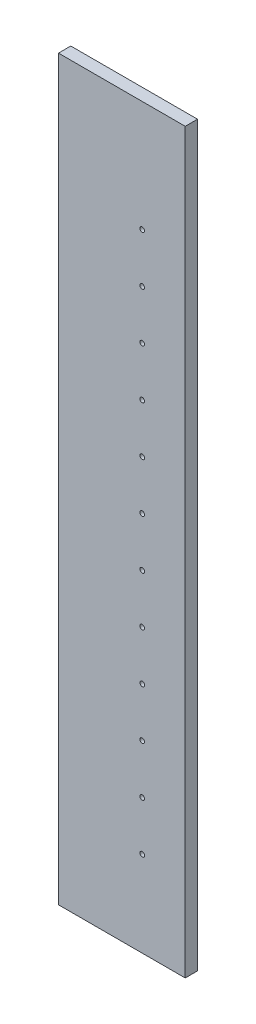
ISO-10303-21;
HEADER;
FILE_DESCRIPTION(('STEP AP214'),'2;1');
FILE_NAME('part.step','',(''),(''),'','','');
FILE_SCHEMA(('AUTOMOTIVE_DESIGN { 1 0 10303 214 1 1 1 1 }'));
ENDSEC;
DATA;
#1=APPLICATION_CONTEXT('core data for automotive mechanical design processes');
#2=APPLICATION_PROTOCOL_DEFINITION('international standard','automotive_design',2000,#1);
#3=PRODUCT_CONTEXT('',#1,'mechanical');
#4=PRODUCT('Part','Part','',(#3));
#5=PRODUCT_RELATED_PRODUCT_CATEGORY('part','',(#4));
#6=PRODUCT_DEFINITION_FORMATION('','',#4);
#7=PRODUCT_DEFINITION_CONTEXT('part definition',#1,'design');
#8=PRODUCT_DEFINITION('design','',#6,#7);
#9=PRODUCT_DEFINITION_SHAPE('','',#8);
#10=(LENGTH_UNIT() NAMED_UNIT(*) SI_UNIT(.MILLI.,.METRE.));
#11=(NAMED_UNIT(*) PLANE_ANGLE_UNIT() SI_UNIT($,.RADIAN.));
#12=(NAMED_UNIT(*) SI_UNIT($,.STERADIAN.) SOLID_ANGLE_UNIT());
#13=UNCERTAINTY_MEASURE_WITH_UNIT(LENGTH_MEASURE(1.E-05),#10,'distance_accuracy_value','');
#14=(GEOMETRIC_REPRESENTATION_CONTEXT(3) GLOBAL_UNCERTAINTY_ASSIGNED_CONTEXT((#13)) GLOBAL_UNIT_ASSIGNED_CONTEXT((#10,
#11,#12)) REPRESENTATION_CONTEXT('',''));
#15=CARTESIAN_POINT('',(0.,0.,0.));
#16=DIRECTION('',(0.,0.,1.));
#17=DIRECTION('',(1.,0.,0.));
#18=AXIS2_PLACEMENT_3D('',#15,#16,#17);
#19=CARTESIAN_POINT('',(0.,0.,-2.50339508056641E-06));
#20=DIRECTION('',(0.,0.,1.));
#21=DIRECTION('',(1.,0.,0.));
#22=AXIS2_PLACEMENT_3D('',#19,#20,#21);
#23=PLANE('',#22);
#24=CARTESIAN_POINT('',(10.8999881744385,11.1500005722046,-2.50339508064273E-06));
#25=DIRECTION('',(0.,0.,1.));
#26=DIRECTION('',(1.,0.,0.));
#27=AXIS2_PLACEMENT_3D('',#24,#25,#26);
#28=CIRCLE('',#27,0.305499374866486);
#29=CARTESIAN_POINT('',(11.205487549305,11.1500005722046,-2.50339508064273E-06));
#30=VERTEX_POINT('',#29);
#31=EDGE_CURVE('E140',#30,#30,#28,.F.);
#32=ORIENTED_EDGE('',*,*,#31,.T.);
#33=EDGE_LOOP('',(#32));
#34=FACE_BOUND('',#33,.T.);
#35=CARTESIAN_POINT('',(10.8999881744385,17.5500011444092,-2.50339508064273E-06));
#36=DIRECTION('',(0.,0.,1.));
#37=DIRECTION('',(1.,0.,0.));
#38=AXIS2_PLACEMENT_3D('',#35,#36,#37);
#39=CIRCLE('',#38,0.305499374866486);
#40=CARTESIAN_POINT('',(11.205487549305,17.5500011444092,-2.50339508064273E-06));
#41=VERTEX_POINT('',#40);
#42=EDGE_CURVE('E143',#41,#41,#39,.F.);
#43=ORIENTED_EDGE('',*,*,#42,.T.);
#44=EDGE_LOOP('',(#43));
#45=FACE_BOUND('',#44,.T.);
#46=CARTESIAN_POINT('',(10.8999881744385,23.9500007629395,-2.50339508064273E-06));
#47=DIRECTION('',(0.,0.,1.));
#48=DIRECTION('',(1.,0.,0.));
#49=AXIS2_PLACEMENT_3D('',#46,#47,#48);
#50=CIRCLE('',#49,0.305499374866486);
#51=CARTESIAN_POINT('',(11.205487549305,23.9500007629395,-2.50339508064273E-06));
#52=VERTEX_POINT('',#51);
#53=EDGE_CURVE('E148',#52,#52,#50,.F.);
#54=ORIENTED_EDGE('',*,*,#53,.T.);
#55=EDGE_LOOP('',(#54));
#56=FACE_BOUND('',#55,.T.);
#57=CARTESIAN_POINT('',(10.8999881744385,30.3500003814697,-2.50339508064273E-06));
#58=DIRECTION('',(0.,0.,1.));
#59=DIRECTION('',(1.,0.,0.));
#60=AXIS2_PLACEMENT_3D('',#57,#58,#59);
#61=CIRCLE('',#60,0.305499374866486);
#62=CARTESIAN_POINT('',(11.205487549305,30.3500003814697,-2.50339508064273E-06));
#63=VERTEX_POINT('',#62);
#64=EDGE_CURVE('E153',#63,#63,#61,.F.);
#65=ORIENTED_EDGE('',*,*,#64,.T.);
#66=EDGE_LOOP('',(#65));
#67=FACE_BOUND('',#66,.T.);
#68=CARTESIAN_POINT('',(10.8999881744385,36.75,-2.50339508064273E-06));
#69=DIRECTION('',(0.,0.,1.));
#70=DIRECTION('',(1.,0.,0.));
#71=AXIS2_PLACEMENT_3D('',#68,#69,#70);
#72=CIRCLE('',#71,0.305499374866486);
#73=CARTESIAN_POINT('',(11.205487549305,36.75,-2.50339508064273E-06));
#74=VERTEX_POINT('',#73);
#75=EDGE_CURVE('E158',#74,#74,#72,.F.);
#76=ORIENTED_EDGE('',*,*,#75,.T.);
#77=EDGE_LOOP('',(#76));
#78=FACE_BOUND('',#77,.T.);
#79=CARTESIAN_POINT('',(10.8999881744385,43.1499977111816,-2.50339508064273E-06));
#80=DIRECTION('',(0.,0.,1.));
#81=DIRECTION('',(1.,0.,0.));
#82=AXIS2_PLACEMENT_3D('',#79,#80,#81);
#83=CIRCLE('',#82,0.305499374866486);
#84=CARTESIAN_POINT('',(11.205487549305,43.1499977111816,-2.50339508064273E-06));
#85=VERTEX_POINT('',#84);
#86=EDGE_CURVE('E163',#85,#85,#83,.F.);
#87=ORIENTED_EDGE('',*,*,#86,.T.);
#88=EDGE_LOOP('',(#87));
#89=FACE_BOUND('',#88,.T.);
#90=CARTESIAN_POINT('',(10.8999881744385,49.5499992370605,-2.50339508064273E-06));
#91=DIRECTION('',(0.,0.,1.));
#92=DIRECTION('',(1.,0.,0.));
#93=AXIS2_PLACEMENT_3D('',#90,#91,#92);
#94=CIRCLE('',#93,0.305499374866486);
#95=CARTESIAN_POINT('',(11.205487549305,49.5499992370605,-2.50339508064273E-06));
#96=VERTEX_POINT('',#95);
#97=EDGE_CURVE('E168',#96,#96,#94,.F.);
#98=ORIENTED_EDGE('',*,*,#97,.T.);
#99=EDGE_LOOP('',(#98));
#100=FACE_BOUND('',#99,.T.);
#101=CARTESIAN_POINT('',(10.8999881744385,55.9500007629395,-2.50339508064273E-06));
#102=DIRECTION('',(0.,0.,1.));
#103=DIRECTION('',(1.,0.,0.));
#104=AXIS2_PLACEMENT_3D('',#101,#102,#103);
#105=CIRCLE('',#104,0.305499374866486);
#106=CARTESIAN_POINT('',(11.205487549305,55.9500007629395,-2.50339508064273E-06));
#107=VERTEX_POINT('',#106);
#108=EDGE_CURVE('E173',#107,#107,#105,.F.);
#109=ORIENTED_EDGE('',*,*,#108,.T.);
#110=EDGE_LOOP('',(#109));
#111=FACE_BOUND('',#110,.T.);
#112=CARTESIAN_POINT('',(10.8999881744385,62.3499984741211,-2.50339508064273E-06));
#113=DIRECTION('',(0.,0.,1.));
#114=DIRECTION('',(1.,0.,0.));
#115=AXIS2_PLACEMENT_3D('',#112,#113,#114);
#116=CIRCLE('',#115,0.305499374866486);
#117=CARTESIAN_POINT('',(11.205487549305,62.3499984741211,-2.50339508064273E-06));
#118=VERTEX_POINT('',#117);
#119=EDGE_CURVE('E178',#118,#118,#116,.F.);
#120=ORIENTED_EDGE('',*,*,#119,.T.);
#121=EDGE_LOOP('',(#120));
#122=FACE_BOUND('',#121,.T.);
#123=CARTESIAN_POINT('',(10.8999881744385,68.75,-2.50339508064273E-06));
#124=DIRECTION('',(0.,0.,1.));
#125=DIRECTION('',(1.,0.,0.));
#126=AXIS2_PLACEMENT_3D('',#123,#124,#125);
#127=CIRCLE('',#126,0.305499374866486);
#128=CARTESIAN_POINT('',(11.205487549305,68.75,-2.50339508064273E-06));
#129=VERTEX_POINT('',#128);
#130=EDGE_CURVE('E183',#129,#129,#127,.F.);
#131=ORIENTED_EDGE('',*,*,#130,.T.);
#132=EDGE_LOOP('',(#131));
#133=FACE_BOUND('',#132,.T.);
#134=CARTESIAN_POINT('',(10.8999881744385,75.1500015258789,-2.50339508064273E-06));
#135=DIRECTION('',(0.,0.,1.));
#136=DIRECTION('',(1.,0.,0.));
#137=AXIS2_PLACEMENT_3D('',#134,#135,#136);
#138=CIRCLE('',#137,0.305499374866486);
#139=CARTESIAN_POINT('',(11.205487549305,75.1500015258789,-2.50339508064273E-06));
#140=VERTEX_POINT('',#139);
#141=EDGE_CURVE('E188',#140,#140,#138,.F.);
#142=ORIENTED_EDGE('',*,*,#141,.T.);
#143=EDGE_LOOP('',(#142));
#144=FACE_BOUND('',#143,.T.);
#145=CARTESIAN_POINT('',(10.8999881744385,81.5500030517578,-2.50339508064273E-06));
#146=DIRECTION('',(0.,0.,1.));
#147=DIRECTION('',(1.,0.,0.));
#148=AXIS2_PLACEMENT_3D('',#145,#146,#147);
#149=CIRCLE('',#148,0.305499374866486);
#150=CARTESIAN_POINT('',(11.205487549305,81.5500030517578,-2.50339508064273E-06));
#151=VERTEX_POINT('',#150);
#152=EDGE_CURVE('E193',#151,#151,#149,.F.);
#153=ORIENTED_EDGE('',*,*,#152,.T.);
#154=EDGE_LOOP('',(#153));
#155=FACE_BOUND('',#154,.T.);
#156=DIRECTION('',(1.,0.,0.));
#157=VECTOR('',#156,1.);
#158=CARTESIAN_POINT('',(16.5000133514404,96.0000076293945,-2.50339508064273E-06));
#159=LINE('',#158,#157);
#160=CARTESIAN_POINT('',(-1.27000002977037E-05,96.0000076293945,-2.50339508060457E-06));
#161=VERTEX_POINT('',#160);
#162=CARTESIAN_POINT('',(16.5000133514404,96.0000076293945,-2.50339508060457E-06));
#163=VERTEX_POINT('',#162);
#164=EDGE_CURVE('E54',#161,#163,#159,.T.);
#165=ORIENTED_EDGE('',*,*,#164,.F.);
#166=DIRECTION('',(0.,1.,0.));
#167=VECTOR('',#166,1.);
#168=CARTESIAN_POINT('',(-1.27000002976274E-05,96.0000076293945,-2.50339508064273E-06));
#169=LINE('',#168,#167);
#170=CARTESIAN_POINT('',(-1.27000002976274E-05,-1.52399998130104E-05,-2.50339507997313E-06));
#171=VERTEX_POINT('',#170);
#172=EDGE_CURVE('E71',#171,#161,#169,.T.);
#173=ORIENTED_EDGE('',*,*,#172,.F.);
#174=DIRECTION('',(0.999999999999988,1.53939121423802E-07,0.));
#175=VECTOR('',#174,1.);
#176=CARTESIAN_POINT('',(-1.27000002976274E-05,-1.52399998114561E-05,-2.50339507977537E-06));
#177=LINE('',#176,#175);
#178=CARTESIAN_POINT('',(16.5000133514404,-1.39700000545418E-05,-2.50339508041484E-06));
#179=VERTEX_POINT('',#178);
#180=EDGE_CURVE('E68',#179,#171,#177,.F.);
#181=ORIENTED_EDGE('',*,*,#180,.F.);
#182=DIRECTION('',(0.,1.,0.));
#183=VECTOR('',#182,1.);
#184=CARTESIAN_POINT('',(16.5000133514404,-1.27000002976274E-05,-2.50339508064273E-06));
#185=LINE('',#184,#183);
#186=EDGE_CURVE('E59',#163,#179,#185,.F.);
#187=ORIENTED_EDGE('',*,*,#186,.F.);
#188=EDGE_LOOP('',(#165,#173,#181,#187));
#189=FACE_BOUND('',#188,.T.);
#190=ADVANCED_FACE('F17',(#34,#45,#56,#67,#78,#89,#100,#111,#122,#133,#144,#155,#189),#23,.T.);
#191=CARTESIAN_POINT('',(-1.27000002976274E-05,-1.52399998114561E-05,-1.59999930858612));
#192=DIRECTION('',(1.53939121423802E-07,-0.999999999999988,0.));
#193=DIRECTION('',(0.999999999999988,1.53939121423802E-07,0.));
#194=AXIS2_PLACEMENT_3D('',#191,#192,#193);
#195=PLANE('',#194);
#196=ORIENTED_EDGE('',*,*,#180,.T.);
#197=DIRECTION('',(0.,0.,1.));
#198=VECTOR('',#197,1.);
#199=CARTESIAN_POINT('',(-1.27000002976274E-05,-1.52399998176733E-05,-1.59999930858612));
#200=LINE('',#199,#198);
#201=CARTESIAN_POINT('',(-1.27000002976274E-05,-1.52399998130104E-05,-1.59999930858612));
#202=VERTEX_POINT('',#201);
#203=EDGE_CURVE('E199',#202,#171,#200,.T.);
#204=ORIENTED_EDGE('',*,*,#203,.F.);
#205=DIRECTION('',(1.,0.,0.));
#206=VECTOR('',#205,1.);
#207=CARTESIAN_POINT('',(0.,-1.52399998114561E-05,-1.59999930858612));
#208=LINE('',#207,#206);
#209=CARTESIAN_POINT('',(16.5000133514404,-1.33350001760846E-05,-1.59999930858612));
#210=VERTEX_POINT('',#209);
#211=EDGE_CURVE('E78',#202,#210,#208,.T.);
#212=ORIENTED_EDGE('',*,*,#211,.T.);
#213=DIRECTION('',(0.,0.,-1.));
#214=VECTOR('',#213,1.);
#215=CARTESIAN_POINT('',(16.5000133514404,-1.27000002976274E-05,-1.59999930858612));
#216=LINE('',#215,#214);
#217=EDGE_CURVE('E64',#179,#210,#216,.T.);
#218=ORIENTED_EDGE('',*,*,#217,.F.);
#219=EDGE_LOOP('',(#196,#204,#212,#218));
#220=FACE_BOUND('',#219,.T.);
#221=ADVANCED_FACE('F77',(#220),#195,.T.);
#222=CARTESIAN_POINT('',(16.5000133514404,-1.27000002976274E-05,-1.59999930858612));
#223=DIRECTION('',(1.,0.,0.));
#224=DIRECTION('',(0.,0.,-1.));
#225=AXIS2_PLACEMENT_3D('',#222,#223,#224);
#226=PLANE('',#225);
#227=ORIENTED_EDGE('',*,*,#186,.T.);
#228=ORIENTED_EDGE('',*,*,#217,.T.);
#229=DIRECTION('',(0.,1.,0.));
#230=VECTOR('',#229,1.);
#231=CARTESIAN_POINT('',(16.5000133514404,0.,-1.59999930858612));
#232=LINE('',#231,#230);
#233=CARTESIAN_POINT('',(16.5000133514404,96.0000076293945,-1.59999930858612));
#234=VERTEX_POINT('',#233);
#235=EDGE_CURVE('E210',#210,#234,#232,.T.);
#236=ORIENTED_EDGE('',*,*,#235,.T.);
#237=DIRECTION('',(0.,0.,1.));
#238=VECTOR('',#237,1.);
#239=CARTESIAN_POINT('',(16.5000133514404,96.0000076293945,-1.59999930858612));
#240=LINE('',#239,#238);
#241=EDGE_CURVE('E66',#163,#234,#240,.F.);
#242=ORIENTED_EDGE('',*,*,#241,.F.);
#243=EDGE_LOOP('',(#227,#228,#236,#242));
#244=FACE_BOUND('',#243,.T.);
#245=ADVANCED_FACE('F61',(#244),#226,.T.);
#246=CARTESIAN_POINT('',(16.5000133514404,96.0000076293945,-1.59999930858612));
#247=DIRECTION('',(0.,1.,0.));
#248=DIRECTION('',(0.,0.,1.));
#249=AXIS2_PLACEMENT_3D('',#246,#247,#248);
#250=PLANE('',#249);
#251=ORIENTED_EDGE('',*,*,#164,.T.);
#252=ORIENTED_EDGE('',*,*,#241,.T.);
#253=DIRECTION('',(1.,0.,0.));
#254=VECTOR('',#253,1.);
#255=CARTESIAN_POINT('',(0.,96.0000076293945,-1.59999930858612));
#256=LINE('',#255,#254);
#257=CARTESIAN_POINT('',(-1.27000002977801E-05,96.0000076293945,-1.59999930858612));
#258=VERTEX_POINT('',#257);
#259=EDGE_CURVE('E207',#234,#258,#256,.F.);
#260=ORIENTED_EDGE('',*,*,#259,.T.);
#261=DIRECTION('',(0.,0.,1.));
#262=VECTOR('',#261,1.);
#263=CARTESIAN_POINT('',(-1.27000002976274E-05,96.0000076293945,-1.59999930858612));
#264=LINE('',#263,#262);
#265=EDGE_CURVE('E35',#161,#258,#264,.F.);
#266=ORIENTED_EDGE('',*,*,#265,.F.);
#267=EDGE_LOOP('',(#251,#252,#260,#266));
#268=FACE_BOUND('',#267,.T.);
#269=ADVANCED_FACE('F206',(#268),#250,.T.);
#270=CARTESIAN_POINT('',(-1.27000002976274E-05,96.0000076293945,-1.59999930858612));
#271=DIRECTION('',(-1.,0.,0.));
#272=DIRECTION('',(0.,0.,1.));
#273=AXIS2_PLACEMENT_3D('',#270,#271,#272);
#274=PLANE('',#273);
#275=ORIENTED_EDGE('',*,*,#172,.T.);
#276=ORIENTED_EDGE('',*,*,#265,.T.);
#277=DIRECTION('',(0.,1.,0.));
#278=VECTOR('',#277,1.);
#279=CARTESIAN_POINT('',(-1.27000002976274E-05,0.,-1.59999930858612));
#280=LINE('',#279,#278);
#281=EDGE_CURVE('E137',#258,#202,#280,.F.);
#282=ORIENTED_EDGE('',*,*,#281,.T.);
#283=ORIENTED_EDGE('',*,*,#203,.T.);
#284=EDGE_LOOP('',(#275,#276,#282,#283));
#285=FACE_BOUND('',#284,.T.);
#286=ADVANCED_FACE('F213',(#285),#274,.T.);
#287=CARTESIAN_POINT('',(10.8999881744385,81.5500030517578,-1.59999930858612));
#288=DIRECTION('',(0.,0.,1.));
#289=DIRECTION('',(1.,0.,0.));
#290=AXIS2_PLACEMENT_3D('',#287,#288,#289);
#291=CYLINDRICAL_SURFACE('',#290,0.305499374866486);
#292=CARTESIAN_POINT('',(10.8999881744385,81.5500030517578,-1.59999930858612));
#293=DIRECTION('',(0.,0.,1.));
#294=DIRECTION('',(1.,0.,0.));
#295=AXIS2_PLACEMENT_3D('',#292,#293,#294);
#296=CIRCLE('',#295,0.305499374866486);
#297=CARTESIAN_POINT('',(11.205487549305,81.5500030517578,-1.59999930858612));
#298=VERTEX_POINT('',#297);
#299=EDGE_CURVE('E132',#298,#298,#296,.F.);
#300=ORIENTED_EDGE('',*,*,#299,.T.);
#301=EDGE_LOOP('',(#300));
#302=FACE_BOUND('',#301,.T.);
#303=ORIENTED_EDGE('',*,*,#152,.F.);
#304=EDGE_LOOP('',(#303));
#305=FACE_BOUND('',#304,.T.);
#306=ADVANCED_FACE('F215',(#302,#305),#291,.F.);
#307=CARTESIAN_POINT('',(10.8999881744385,75.1500015258789,-1.59999930858612));
#308=DIRECTION('',(0.,0.,1.));
#309=DIRECTION('',(1.,0.,0.));
#310=AXIS2_PLACEMENT_3D('',#307,#308,#309);
#311=CYLINDRICAL_SURFACE('',#310,0.305499374866486);
#312=CARTESIAN_POINT('',(10.8999881744385,75.1500015258789,-1.59999930858612));
#313=DIRECTION('',(0.,0.,1.));
#314=DIRECTION('',(1.,0.,0.));
#315=AXIS2_PLACEMENT_3D('',#312,#313,#314);
#316=CIRCLE('',#315,0.305499374866486);
#317=CARTESIAN_POINT('',(11.205487549305,75.1500015258789,-1.59999930858612));
#318=VERTEX_POINT('',#317);
#319=EDGE_CURVE('E127',#318,#318,#316,.F.);
#320=ORIENTED_EDGE('',*,*,#319,.T.);
#321=EDGE_LOOP('',(#320));
#322=FACE_BOUND('',#321,.T.);
#323=ORIENTED_EDGE('',*,*,#141,.F.);
#324=EDGE_LOOP('',(#323));
#325=FACE_BOUND('',#324,.T.);
#326=ADVANCED_FACE('F222',(#322,#325),#311,.F.);
#327=CARTESIAN_POINT('',(10.8999881744385,68.75,-1.59999930858612));
#328=DIRECTION('',(0.,0.,1.));
#329=DIRECTION('',(1.,0.,0.));
#330=AXIS2_PLACEMENT_3D('',#327,#328,#329);
#331=CYLINDRICAL_SURFACE('',#330,0.305499374866486);
#332=CARTESIAN_POINT('',(10.8999881744385,68.75,-1.59999930858612));
#333=DIRECTION('',(0.,0.,1.));
#334=DIRECTION('',(1.,0.,0.));
#335=AXIS2_PLACEMENT_3D('',#332,#333,#334);
#336=CIRCLE('',#335,0.305499374866486);
#337=CARTESIAN_POINT('',(11.205487549305,68.75,-1.59999930858612));
#338=VERTEX_POINT('',#337);
#339=EDGE_CURVE('E122',#338,#338,#336,.F.);
#340=ORIENTED_EDGE('',*,*,#339,.T.);
#341=EDGE_LOOP('',(#340));
#342=FACE_BOUND('',#341,.T.);
#343=ORIENTED_EDGE('',*,*,#130,.F.);
#344=EDGE_LOOP('',(#343));
#345=FACE_BOUND('',#344,.T.);
#346=ADVANCED_FACE('F269',(#342,#345),#331,.F.);
#347=CARTESIAN_POINT('',(10.8999881744385,62.3499984741211,-1.59999930858612));
#348=DIRECTION('',(0.,0.,1.));
#349=DIRECTION('',(1.,0.,0.));
#350=AXIS2_PLACEMENT_3D('',#347,#348,#349);
#351=CYLINDRICAL_SURFACE('',#350,0.305499374866486);
#352=CARTESIAN_POINT('',(10.8999881744385,62.3499984741211,-1.59999930858612));
#353=DIRECTION('',(0.,0.,1.));
#354=DIRECTION('',(1.,0.,0.));
#355=AXIS2_PLACEMENT_3D('',#352,#353,#354);
#356=CIRCLE('',#355,0.305499374866486);
#357=CARTESIAN_POINT('',(11.205487549305,62.3499984741211,-1.59999930858612));
#358=VERTEX_POINT('',#357);
#359=EDGE_CURVE('E117',#358,#358,#356,.F.);
#360=ORIENTED_EDGE('',*,*,#359,.T.);
#361=EDGE_LOOP('',(#360));
#362=FACE_BOUND('',#361,.T.);
#363=ORIENTED_EDGE('',*,*,#119,.F.);
#364=EDGE_LOOP('',(#363));
#365=FACE_BOUND('',#364,.T.);
#366=ADVANCED_FACE('F265',(#362,#365),#351,.F.);
#367=CARTESIAN_POINT('',(10.8999881744385,55.9500007629395,-1.59999930858612));
#368=DIRECTION('',(0.,0.,1.));
#369=DIRECTION('',(1.,0.,0.));
#370=AXIS2_PLACEMENT_3D('',#367,#368,#369);
#371=CYLINDRICAL_SURFACE('',#370,0.305499374866486);
#372=CARTESIAN_POINT('',(10.8999881744385,55.9500007629395,-1.59999930858612));
#373=DIRECTION('',(0.,0.,1.));
#374=DIRECTION('',(1.,0.,0.));
#375=AXIS2_PLACEMENT_3D('',#372,#373,#374);
#376=CIRCLE('',#375,0.305499374866486);
#377=CARTESIAN_POINT('',(11.205487549305,55.9500007629395,-1.59999930858612));
#378=VERTEX_POINT('',#377);
#379=EDGE_CURVE('E112',#378,#378,#376,.F.);
#380=ORIENTED_EDGE('',*,*,#379,.T.);
#381=EDGE_LOOP('',(#380));
#382=FACE_BOUND('',#381,.T.);
#383=ORIENTED_EDGE('',*,*,#108,.F.);
#384=EDGE_LOOP('',(#383));
#385=FACE_BOUND('',#384,.T.);
#386=ADVANCED_FACE('F261',(#382,#385),#371,.F.);
#387=CARTESIAN_POINT('',(10.8999881744385,49.5499992370605,-1.59999930858612));
#388=DIRECTION('',(0.,0.,1.));
#389=DIRECTION('',(1.,0.,0.));
#390=AXIS2_PLACEMENT_3D('',#387,#388,#389);
#391=CYLINDRICAL_SURFACE('',#390,0.305499374866486);
#392=CARTESIAN_POINT('',(10.8999881744385,49.5499992370605,-1.59999930858612));
#393=DIRECTION('',(0.,0.,1.));
#394=DIRECTION('',(1.,0.,0.));
#395=AXIS2_PLACEMENT_3D('',#392,#393,#394);
#396=CIRCLE('',#395,0.305499374866486);
#397=CARTESIAN_POINT('',(11.205487549305,49.5499992370605,-1.59999930858612));
#398=VERTEX_POINT('',#397);
#399=EDGE_CURVE('E107',#398,#398,#396,.F.);
#400=ORIENTED_EDGE('',*,*,#399,.T.);
#401=EDGE_LOOP('',(#400));
#402=FACE_BOUND('',#401,.T.);
#403=ORIENTED_EDGE('',*,*,#97,.F.);
#404=EDGE_LOOP('',(#403));
#405=FACE_BOUND('',#404,.T.);
#406=ADVANCED_FACE('F257',(#402,#405),#391,.F.);
#407=CARTESIAN_POINT('',(10.8999881744385,43.1499977111816,-1.59999930858612));
#408=DIRECTION('',(0.,0.,1.));
#409=DIRECTION('',(1.,0.,0.));
#410=AXIS2_PLACEMENT_3D('',#407,#408,#409);
#411=CYLINDRICAL_SURFACE('',#410,0.305499374866486);
#412=CARTESIAN_POINT('',(10.8999881744385,43.1499977111816,-1.59999930858612));
#413=DIRECTION('',(0.,0.,1.));
#414=DIRECTION('',(1.,0.,0.));
#415=AXIS2_PLACEMENT_3D('',#412,#413,#414);
#416=CIRCLE('',#415,0.305499374866486);
#417=CARTESIAN_POINT('',(11.205487549305,43.1499977111816,-1.59999930858612));
#418=VERTEX_POINT('',#417);
#419=EDGE_CURVE('E102',#418,#418,#416,.F.);
#420=ORIENTED_EDGE('',*,*,#419,.T.);
#421=EDGE_LOOP('',(#420));
#422=FACE_BOUND('',#421,.T.);
#423=ORIENTED_EDGE('',*,*,#86,.F.);
#424=EDGE_LOOP('',(#423));
#425=FACE_BOUND('',#424,.T.);
#426=ADVANCED_FACE('F253',(#422,#425),#411,.F.);
#427=CARTESIAN_POINT('',(10.8999881744385,36.75,-1.59999930858612));
#428=DIRECTION('',(0.,0.,1.));
#429=DIRECTION('',(1.,0.,0.));
#430=AXIS2_PLACEMENT_3D('',#427,#428,#429);
#431=CYLINDRICAL_SURFACE('',#430,0.305499374866486);
#432=CARTESIAN_POINT('',(10.8999881744385,36.75,-1.59999930858612));
#433=DIRECTION('',(0.,0.,1.));
#434=DIRECTION('',(1.,0.,0.));
#435=AXIS2_PLACEMENT_3D('',#432,#433,#434);
#436=CIRCLE('',#435,0.305499374866486);
#437=CARTESIAN_POINT('',(11.205487549305,36.75,-1.59999930858612));
#438=VERTEX_POINT('',#437);
#439=EDGE_CURVE('E97',#438,#438,#436,.F.);
#440=ORIENTED_EDGE('',*,*,#439,.T.);
#441=EDGE_LOOP('',(#440));
#442=FACE_BOUND('',#441,.T.);
#443=ORIENTED_EDGE('',*,*,#75,.F.);
#444=EDGE_LOOP('',(#443));
#445=FACE_BOUND('',#444,.T.);
#446=ADVANCED_FACE('F249',(#442,#445),#431,.F.);
#447=CARTESIAN_POINT('',(10.8999881744385,30.3500003814697,-1.59999930858612));
#448=DIRECTION('',(0.,0.,1.));
#449=DIRECTION('',(1.,0.,0.));
#450=AXIS2_PLACEMENT_3D('',#447,#448,#449);
#451=CYLINDRICAL_SURFACE('',#450,0.305499374866486);
#452=CARTESIAN_POINT('',(10.8999881744385,30.3500003814697,-1.59999930858612));
#453=DIRECTION('',(0.,0.,1.));
#454=DIRECTION('',(1.,0.,0.));
#455=AXIS2_PLACEMENT_3D('',#452,#453,#454);
#456=CIRCLE('',#455,0.305499374866486);
#457=CARTESIAN_POINT('',(11.205487549305,30.3500003814697,-1.59999930858612));
#458=VERTEX_POINT('',#457);
#459=EDGE_CURVE('E92',#458,#458,#456,.F.);
#460=ORIENTED_EDGE('',*,*,#459,.T.);
#461=EDGE_LOOP('',(#460));
#462=FACE_BOUND('',#461,.T.);
#463=ORIENTED_EDGE('',*,*,#64,.F.);
#464=EDGE_LOOP('',(#463));
#465=FACE_BOUND('',#464,.T.);
#466=ADVANCED_FACE('F245',(#462,#465),#451,.F.);
#467=CARTESIAN_POINT('',(10.8999881744385,23.9500007629395,-1.59999930858612));
#468=DIRECTION('',(0.,0.,1.));
#469=DIRECTION('',(1.,0.,0.));
#470=AXIS2_PLACEMENT_3D('',#467,#468,#469);
#471=CYLINDRICAL_SURFACE('',#470,0.305499374866486);
#472=CARTESIAN_POINT('',(10.8999881744385,23.9500007629395,-1.59999930858612));
#473=DIRECTION('',(0.,0.,1.));
#474=DIRECTION('',(1.,0.,0.));
#475=AXIS2_PLACEMENT_3D('',#472,#473,#474);
#476=CIRCLE('',#475,0.305499374866486);
#477=CARTESIAN_POINT('',(11.205487549305,23.9500007629395,-1.59999930858612));
#478=VERTEX_POINT('',#477);
#479=EDGE_CURVE('E87',#478,#478,#476,.F.);
#480=ORIENTED_EDGE('',*,*,#479,.T.);
#481=EDGE_LOOP('',(#480));
#482=FACE_BOUND('',#481,.T.);
#483=ORIENTED_EDGE('',*,*,#53,.F.);
#484=EDGE_LOOP('',(#483));
#485=FACE_BOUND('',#484,.T.);
#486=ADVANCED_FACE('F241',(#482,#485),#471,.F.);
#487=CARTESIAN_POINT('',(10.8999881744385,17.5500011444092,-1.59999930858612));
#488=DIRECTION('',(0.,0.,1.));
#489=DIRECTION('',(1.,0.,0.));
#490=AXIS2_PLACEMENT_3D('',#487,#488,#489);
#491=CYLINDRICAL_SURFACE('',#490,0.305499374866486);
#492=CARTESIAN_POINT('',(10.8999881744385,17.5500011444092,-1.59999930858612));
#493=DIRECTION('',(0.,0.,1.));
#494=DIRECTION('',(1.,0.,0.));
#495=AXIS2_PLACEMENT_3D('',#492,#493,#494);
#496=CIRCLE('',#495,0.305499374866486);
#497=CARTESIAN_POINT('',(11.205487549305,17.5500011444092,-1.59999930858612));
#498=VERTEX_POINT('',#497);
#499=EDGE_CURVE('E26',#498,#498,#496,.F.);
#500=ORIENTED_EDGE('',*,*,#499,.T.);
#501=EDGE_LOOP('',(#500));
#502=FACE_BOUND('',#501,.T.);
#503=ORIENTED_EDGE('',*,*,#42,.F.);
#504=EDGE_LOOP('',(#503));
#505=FACE_BOUND('',#504,.T.);
#506=ADVANCED_FACE('F233',(#502,#505),#491,.F.);
#507=CARTESIAN_POINT('',(10.8999881744385,11.1500005722046,-1.59999930858612));
#508=DIRECTION('',(0.,0.,1.));
#509=DIRECTION('',(1.,0.,0.));
#510=AXIS2_PLACEMENT_3D('',#507,#508,#509);
#511=CYLINDRICAL_SURFACE('',#510,0.305499374866486);
#512=CARTESIAN_POINT('',(10.8999881744385,11.1500005722046,-1.59999930858612));
#513=DIRECTION('',(0.,0.,1.));
#514=DIRECTION('',(1.,0.,0.));
#515=AXIS2_PLACEMENT_3D('',#512,#513,#514);
#516=CIRCLE('',#515,0.305499374866486);
#517=CARTESIAN_POINT('',(11.205487549305,11.1500005722046,-1.59999930858612));
#518=VERTEX_POINT('',#517);
#519=EDGE_CURVE('E11',#518,#518,#516,.F.);
#520=ORIENTED_EDGE('',*,*,#519,.T.);
#521=EDGE_LOOP('',(#520));
#522=FACE_BOUND('',#521,.T.);
#523=ORIENTED_EDGE('',*,*,#31,.F.);
#524=EDGE_LOOP('',(#523));
#525=FACE_BOUND('',#524,.T.);
#526=ADVANCED_FACE('F227',(#522,#525),#511,.F.);
#527=CARTESIAN_POINT('',(0.,0.,-1.59999930858612));
#528=DIRECTION('',(0.,0.,1.));
#529=DIRECTION('',(1.,0.,0.));
#530=AXIS2_PLACEMENT_3D('',#527,#528,#529);
#531=PLANE('',#530);
#532=ORIENTED_EDGE('',*,*,#519,.F.);
#533=EDGE_LOOP('',(#532));
#534=FACE_BOUND('',#533,.T.);
#535=ORIENTED_EDGE('',*,*,#499,.F.);
#536=EDGE_LOOP('',(#535));
#537=FACE_BOUND('',#536,.T.);
#538=ORIENTED_EDGE('',*,*,#479,.F.);
#539=EDGE_LOOP('',(#538));
#540=FACE_BOUND('',#539,.T.);
#541=ORIENTED_EDGE('',*,*,#459,.F.);
#542=EDGE_LOOP('',(#541));
#543=FACE_BOUND('',#542,.T.);
#544=ORIENTED_EDGE('',*,*,#439,.F.);
#545=EDGE_LOOP('',(#544));
#546=FACE_BOUND('',#545,.T.);
#547=ORIENTED_EDGE('',*,*,#419,.F.);
#548=EDGE_LOOP('',(#547));
#549=FACE_BOUND('',#548,.T.);
#550=ORIENTED_EDGE('',*,*,#399,.F.);
#551=EDGE_LOOP('',(#550));
#552=FACE_BOUND('',#551,.T.);
#553=ORIENTED_EDGE('',*,*,#379,.F.);
#554=EDGE_LOOP('',(#553));
#555=FACE_BOUND('',#554,.T.);
#556=ORIENTED_EDGE('',*,*,#359,.F.);
#557=EDGE_LOOP('',(#556));
#558=FACE_BOUND('',#557,.T.);
#559=ORIENTED_EDGE('',*,*,#339,.F.);
#560=EDGE_LOOP('',(#559));
#561=FACE_BOUND('',#560,.T.);
#562=ORIENTED_EDGE('',*,*,#319,.F.);
#563=EDGE_LOOP('',(#562));
#564=FACE_BOUND('',#563,.T.);
#565=ORIENTED_EDGE('',*,*,#299,.F.);
#566=EDGE_LOOP('',(#565));
#567=FACE_BOUND('',#566,.T.);
#568=ORIENTED_EDGE('',*,*,#259,.F.);
#569=ORIENTED_EDGE('',*,*,#235,.F.);
#570=ORIENTED_EDGE('',*,*,#211,.F.);
#571=ORIENTED_EDGE('',*,*,#281,.F.);
#572=EDGE_LOOP('',(#568,#569,#570,#571));
#573=FACE_BOUND('',#572,.T.);
#574=ADVANCED_FACE('F209',(#534,#537,#540,#543,#546,#549,#552,#555,#558,#561,#564,#567,#573),
#531,.F.);
#575=CLOSED_SHELL('',(#190,#221,#245,#269,#286,#306,#326,#346,#366,#386,#406,#426,#446,#466,
#486,#506,#526,#574));
#576=MANIFOLD_SOLID_BREP('B1',#575);
#577=ADVANCED_BREP_SHAPE_REPRESENTATION('',(#18,#576),#14);
#578=SHAPE_DEFINITION_REPRESENTATION(#9,#577);
ENDSEC;
END-ISO-10303-21;
